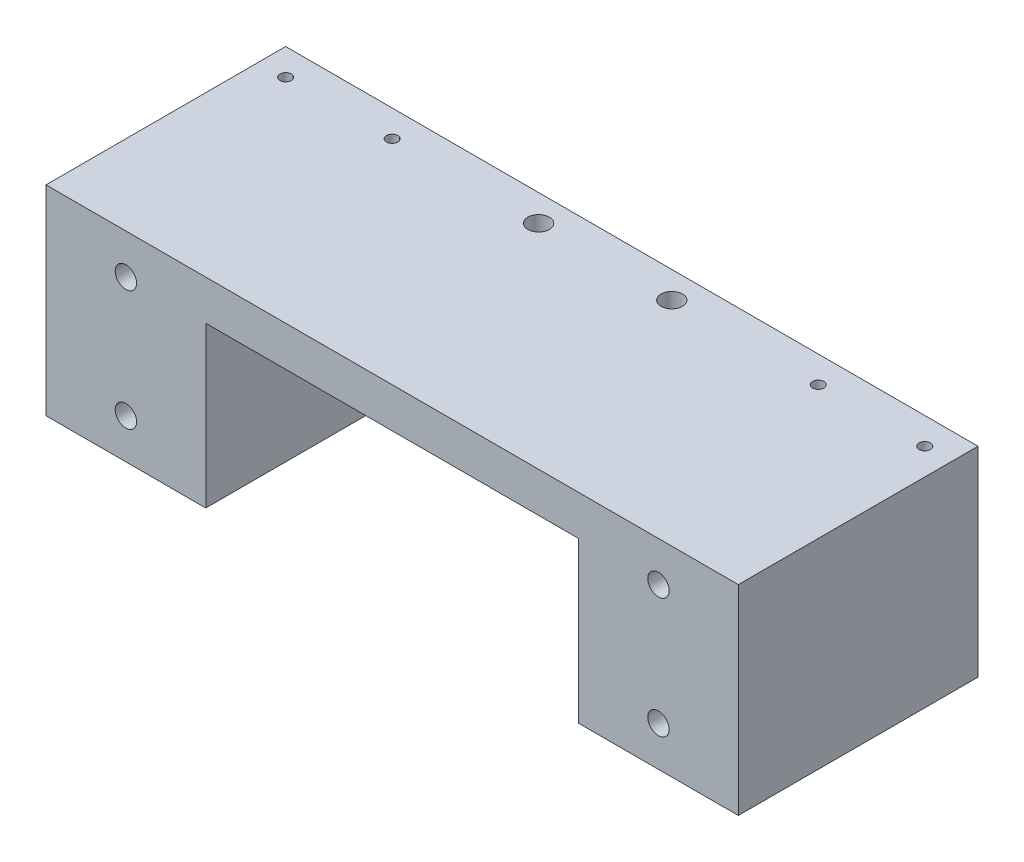
ISO-10303-21;
HEADER;
FILE_DESCRIPTION(('STEP AP214'),'2;1');
FILE_NAME('part.step','',(''),(''),'','','');
FILE_SCHEMA(('AUTOMOTIVE_DESIGN { 1 0 10303 214 1 1 1 1 }'));
ENDSEC;
DATA;
#1=APPLICATION_CONTEXT('core data for automotive mechanical design processes');
#2=APPLICATION_PROTOCOL_DEFINITION('international standard','automotive_design',2000,#1);
#3=PRODUCT_CONTEXT('',#1,'mechanical');
#4=PRODUCT('Part','Part','',(#3));
#5=PRODUCT_RELATED_PRODUCT_CATEGORY('part','',(#4));
#6=PRODUCT_DEFINITION_FORMATION('','',#4);
#7=PRODUCT_DEFINITION_CONTEXT('part definition',#1,'design');
#8=PRODUCT_DEFINITION('design','',#6,#7);
#9=PRODUCT_DEFINITION_SHAPE('','',#8);
#10=(LENGTH_UNIT() NAMED_UNIT(*) SI_UNIT(.MILLI.,.METRE.));
#11=(NAMED_UNIT(*) PLANE_ANGLE_UNIT() SI_UNIT($,.RADIAN.));
#12=(NAMED_UNIT(*) SI_UNIT($,.STERADIAN.) SOLID_ANGLE_UNIT());
#13=UNCERTAINTY_MEASURE_WITH_UNIT(LENGTH_MEASURE(1.E-05),#10,'distance_accuracy_value','');
#14=(GEOMETRIC_REPRESENTATION_CONTEXT(3) GLOBAL_UNCERTAINTY_ASSIGNED_CONTEXT((#13)) GLOBAL_UNIT_ASSIGNED_CONTEXT((#10,
#11,#12)) REPRESENTATION_CONTEXT('',''));
#15=CARTESIAN_POINT('',(0.,0.,0.));
#16=DIRECTION('',(0.,0.,1.));
#17=DIRECTION('',(1.,0.,0.));
#18=AXIS2_PLACEMENT_3D('',#15,#16,#17);
#19=CARTESIAN_POINT('',(3.17499999999999,98.425,-52.3875));
#20=DIRECTION('',(-1.,0.,0.));
#21=DIRECTION('',(0.,0.,1.));
#22=AXIS2_PLACEMENT_3D('',#19,#20,#21);
#23=PLANE('',#22);
#24=DIRECTION('',(0.,-1.,0.));
#25=VECTOR('',#24,1.);
#26=CARTESIAN_POINT('',(3.17499999999999,98.425,-49.2125));
#27=LINE('',#26,#25);
#28=CARTESIAN_POINT('',(3.17499999999999,104.775,-49.2125));
#29=VERTEX_POINT('',#28);
#30=CARTESIAN_POINT('',(3.17499999999999,98.425,-49.2125));
#31=VERTEX_POINT('',#30);
#32=EDGE_CURVE('E113',#29,#31,#27,.T.);
#33=ORIENTED_EDGE('',*,*,#32,.T.);
#34=DIRECTION('',(0.,0.,1.));
#35=VECTOR('',#34,1.);
#36=CARTESIAN_POINT('',(3.17499999999999,98.425,-52.3875));
#37=LINE('',#36,#35);
#38=CARTESIAN_POINT('',(3.17499999999999,98.425,-52.3875));
#39=VERTEX_POINT('',#38);
#40=EDGE_CURVE('E12',#39,#31,#37,.T.);
#41=ORIENTED_EDGE('',*,*,#40,.F.);
#42=DIRECTION('',(0.,-1.,0.));
#43=VECTOR('',#42,1.);
#44=CARTESIAN_POINT('',(3.17499999999999,98.425,-52.3875));
#45=LINE('',#44,#43);
#46=CARTESIAN_POINT('',(3.17499999999999,104.775,-52.3875));
#47=VERTEX_POINT('',#46);
#48=EDGE_CURVE('E101',#47,#39,#45,.T.);
#49=ORIENTED_EDGE('',*,*,#48,.F.);
#50=DIRECTION('',(0.,0.,1.));
#51=VECTOR('',#50,1.);
#52=CARTESIAN_POINT('',(3.17499999999999,104.775,-52.3875));
#53=LINE('',#52,#51);
#54=EDGE_CURVE('E109',#47,#29,#53,.T.);
#55=ORIENTED_EDGE('',*,*,#54,.T.);
#56=EDGE_LOOP('',(#33,#41,#49,#55));
#57=FACE_BOUND('',#56,.T.);
#58=ADVANCED_FACE('F50',(#57),#23,.F.);
#59=CARTESIAN_POINT('',(-3.17500000000001,98.425,-52.3875));
#60=DIRECTION('',(0.,1.,0.));
#61=DIRECTION('',(0.,0.,1.));
#62=AXIS2_PLACEMENT_3D('',#59,#60,#61);
#63=PLANE('',#62);
#64=DIRECTION('',(-1.,0.,0.));
#65=VECTOR('',#64,1.);
#66=CARTESIAN_POINT('',(-3.17500000000001,98.425,-49.2125));
#67=LINE('',#66,#65);
#68=CARTESIAN_POINT('',(-3.17500000000001,98.425,-49.2125));
#69=VERTEX_POINT('',#68);
#70=EDGE_CURVE('E105',#31,#69,#67,.T.);
#71=ORIENTED_EDGE('',*,*,#70,.T.);
#72=DIRECTION('',(0.,0.,1.));
#73=VECTOR('',#72,1.);
#74=CARTESIAN_POINT('',(-3.17500000000001,98.425,-52.3875));
#75=LINE('',#74,#73);
#76=CARTESIAN_POINT('',(-3.17500000000001,98.425,-52.3875));
#77=VERTEX_POINT('',#76);
#78=EDGE_CURVE('E58',#77,#69,#75,.T.);
#79=ORIENTED_EDGE('',*,*,#78,.F.);
#80=DIRECTION('',(-1.,0.,0.));
#81=VECTOR('',#80,1.);
#82=CARTESIAN_POINT('',(-3.17500000000001,98.425,-52.3875));
#83=LINE('',#82,#81);
#84=EDGE_CURVE('E96',#39,#77,#83,.T.);
#85=ORIENTED_EDGE('',*,*,#84,.F.);
#86=ORIENTED_EDGE('',*,*,#40,.T.);
#87=EDGE_LOOP('',(#71,#79,#85,#86));
#88=FACE_BOUND('',#87,.T.);
#89=ADVANCED_FACE('F104',(#88),#63,.F.);
#90=CARTESIAN_POINT('',(-3.17500000000001,98.425,-52.3875));
#91=DIRECTION('',(1.,0.,0.));
#92=DIRECTION('',(0.,0.,-1.));
#93=AXIS2_PLACEMENT_3D('',#90,#91,#92);
#94=PLANE('',#93);
#95=DIRECTION('',(0.,1.,0.));
#96=VECTOR('',#95,1.);
#97=CARTESIAN_POINT('',(-3.17500000000001,98.425,-49.2125));
#98=LINE('',#97,#96);
#99=CARTESIAN_POINT('',(-3.17500000000001,104.775,-49.2125));
#100=VERTEX_POINT('',#99);
#101=EDGE_CURVE('E83',#69,#100,#98,.T.);
#102=ORIENTED_EDGE('',*,*,#101,.T.);
#103=DIRECTION('',(0.,0.,1.));
#104=VECTOR('',#103,1.);
#105=CARTESIAN_POINT('',(-3.17500000000001,104.775,-52.3875));
#106=LINE('',#105,#104);
#107=CARTESIAN_POINT('',(-3.17500000000001,104.775,-52.3875));
#108=VERTEX_POINT('',#107);
#109=EDGE_CURVE('E106',#108,#100,#106,.T.);
#110=ORIENTED_EDGE('',*,*,#109,.F.);
#111=DIRECTION('',(0.,1.,0.));
#112=VECTOR('',#111,1.);
#113=CARTESIAN_POINT('',(-3.17500000000001,98.425,-52.3875));
#114=LINE('',#113,#112);
#115=EDGE_CURVE('E99',#77,#108,#114,.T.);
#116=ORIENTED_EDGE('',*,*,#115,.F.);
#117=ORIENTED_EDGE('',*,*,#78,.T.);
#118=EDGE_LOOP('',(#102,#110,#116,#117));
#119=FACE_BOUND('',#118,.T.);
#120=ADVANCED_FACE('F107',(#119),#94,.F.);
#121=CARTESIAN_POINT('',(-3.17500000000001,104.775,-52.3875));
#122=DIRECTION('',(0.,-1.,0.));
#123=DIRECTION('',(0.,0.,-1.));
#124=AXIS2_PLACEMENT_3D('',#121,#122,#123);
#125=PLANE('',#124);
#126=DIRECTION('',(1.,0.,0.));
#127=VECTOR('',#126,1.);
#128=CARTESIAN_POINT('',(-3.17500000000001,104.775,-49.2125));
#129=LINE('',#128,#127);
#130=EDGE_CURVE('E89',#100,#29,#129,.T.);
#131=ORIENTED_EDGE('',*,*,#130,.T.);
#132=ORIENTED_EDGE('',*,*,#54,.F.);
#133=DIRECTION('',(1.,0.,0.));
#134=VECTOR('',#133,1.);
#135=CARTESIAN_POINT('',(-3.17500000000001,104.775,-52.3875));
#136=LINE('',#135,#134);
#137=EDGE_CURVE('E66',#108,#47,#136,.T.);
#138=ORIENTED_EDGE('',*,*,#137,.F.);
#139=ORIENTED_EDGE('',*,*,#109,.T.);
#140=EDGE_LOOP('',(#131,#132,#138,#139));
#141=FACE_BOUND('',#140,.T.);
#142=ADVANCED_FACE('F121',(#141),#125,.F.);
#143=CARTESIAN_POINT('',(0.,0.,-52.3875));
#144=DIRECTION('',(0.,0.,-1.));
#145=DIRECTION('',(-1.,0.,0.));
#146=AXIS2_PLACEMENT_3D('',#143,#144,#145);
#147=PLANE('',#146);
#148=CARTESIAN_POINT('',(0.,101.6,-52.3875));
#149=DIRECTION('',(0.,0.,-1.));
#150=DIRECTION('',(-1.,0.,0.));
#151=AXIS2_PLACEMENT_3D('',#148,#149,#150);
#152=CIRCLE('',#151,1.5875);
#153=CARTESIAN_POINT('',(-1.5875,101.6,-52.3875));
#154=VERTEX_POINT('',#153);
#155=EDGE_CURVE('E129',#154,#154,#152,.T.);
#156=ORIENTED_EDGE('',*,*,#155,.F.);
#157=EDGE_LOOP('',(#156));
#158=FACE_BOUND('',#157,.T.);
#159=ORIENTED_EDGE('',*,*,#48,.T.);
#160=ORIENTED_EDGE('',*,*,#84,.T.);
#161=ORIENTED_EDGE('',*,*,#115,.T.);
#162=ORIENTED_EDGE('',*,*,#137,.T.);
#163=EDGE_LOOP('',(#159,#160,#161,#162));
#164=FACE_BOUND('',#163,.T.);
#165=ADVANCED_FACE('F97',(#158,#164),#147,.T.);
#166=CARTESIAN_POINT('',(0.,0.,-49.2125));
#167=DIRECTION('',(0.,0.,-1.));
#168=DIRECTION('',(-1.,0.,0.));
#169=AXIS2_PLACEMENT_3D('',#166,#167,#168);
#170=PLANE('',#169);
#171=CARTESIAN_POINT('',(0.,101.6,-49.2125));
#172=DIRECTION('',(0.,0.,-1.));
#173=DIRECTION('',(-1.,0.,0.));
#174=AXIS2_PLACEMENT_3D('',#171,#172,#173);
#175=CIRCLE('',#174,1.5875);
#176=CARTESIAN_POINT('',(-1.5875,101.6,-49.2125));
#177=VERTEX_POINT('',#176);
#178=EDGE_CURVE('E116',#177,#177,#175,.F.);
#179=ORIENTED_EDGE('',*,*,#178,.F.);
#180=EDGE_LOOP('',(#179));
#181=FACE_BOUND('',#180,.T.);
#182=ORIENTED_EDGE('',*,*,#32,.F.);
#183=ORIENTED_EDGE('',*,*,#130,.F.);
#184=ORIENTED_EDGE('',*,*,#101,.F.);
#185=ORIENTED_EDGE('',*,*,#70,.F.);
#186=EDGE_LOOP('',(#182,#183,#184,#185));
#187=FACE_BOUND('',#186,.T.);
#188=ADVANCED_FACE('F124',(#181,#187),#170,.F.);
#189=CARTESIAN_POINT('',(0.,101.6,19.051));
#190=DIRECTION('',(0.,0.,-1.));
#191=DIRECTION('',(-1.,0.,0.));
#192=AXIS2_PLACEMENT_3D('',#189,#190,#191);
#193=CYLINDRICAL_SURFACE('',#192,1.5875);
#194=ORIENTED_EDGE('',*,*,#155,.T.);
#195=EDGE_LOOP('',(#194));
#196=FACE_BOUND('',#195,.T.);
#197=ORIENTED_EDGE('',*,*,#178,.T.);
#198=EDGE_LOOP('',(#197));
#199=FACE_BOUND('',#198,.T.);
#200=ADVANCED_FACE('F133',(#196,#199),#193,.F.);
#201=CLOSED_SHELL('',(#58,#89,#120,#142,#165,#188,#200));
#202=MANIFOLD_SOLID_BREP('B2',#201);
#203=CARTESIAN_POINT('',(82.55,-114.3,19.05));
#204=DIRECTION('',(-1.,0.,0.));
#205=DIRECTION('',(0.,0.,1.));
#206=AXIS2_PLACEMENT_3D('',#203,#204,#205);
#207=PLANE('',#206);
#208=DIRECTION('',(0.,0.,-1.));
#209=VECTOR('',#208,1.);
#210=CARTESIAN_POINT('',(82.55,114.3,19.05));
#211=LINE('',#210,#209);
#212=CARTESIAN_POINT('',(82.5499999999999,114.3,0.));
#213=VERTEX_POINT('',#212);
#214=CARTESIAN_POINT('',(82.55,114.3,-57.15));
#215=VERTEX_POINT('',#214);
#216=EDGE_CURVE('E48',#213,#215,#211,.T.);
#217=ORIENTED_EDGE('',*,*,#216,.F.);
#218=DIRECTION('',(0.,-1.,0.));
#219=VECTOR('',#218,1.);
#220=CARTESIAN_POINT('',(82.55,-114.3,0.));
#221=LINE('',#220,#219);
#222=CARTESIAN_POINT('',(82.55,66.6142131223968,0.));
#223=VERTEX_POINT('',#222);
#224=EDGE_CURVE('E260',#213,#223,#221,.T.);
#225=ORIENTED_EDGE('',*,*,#224,.T.);
#226=DIRECTION('',(0.,0.,-1.));
#227=VECTOR('',#226,1.);
#228=CARTESIAN_POINT('',(82.55,66.6142131223968,-57.15));
#229=LINE('',#228,#227);
#230=CARTESIAN_POINT('',(82.55,66.6142131223968,-57.15));
#231=VERTEX_POINT('',#230);
#232=EDGE_CURVE('E309',#223,#231,#229,.T.);
#233=ORIENTED_EDGE('',*,*,#232,.T.);
#234=DIRECTION('',(0.,-1.,0.));
#235=VECTOR('',#234,1.);
#236=CARTESIAN_POINT('',(82.55,114.3,-57.15));
#237=LINE('',#236,#235);
#238=EDGE_CURVE('E282',#215,#231,#237,.T.);
#239=ORIENTED_EDGE('',*,*,#238,.F.);
#240=EDGE_LOOP('',(#217,#225,#233,#239));
#241=FACE_BOUND('',#240,.T.);
#242=ADVANCED_FACE('F194',(#241),#207,.F.);
#243=CARTESIAN_POINT('',(82.55,104.775,-57.15));
#244=DIRECTION('',(0.,1.,0.));
#245=DIRECTION('',(0.,0.,1.));
#246=AXIS2_PLACEMENT_3D('',#243,#244,#245);
#247=PLANE('',#246);
#248=CARTESIAN_POINT('',(15.875,104.775,-50.8));
#249=DIRECTION('',(0.,1.,0.));
#250=DIRECTION('',(0.,0.,1.));
#251=AXIS2_PLACEMENT_3D('',#248,#249,#250);
#252=CIRCLE('',#251,2.55269999999998);
#253=CARTESIAN_POINT('',(15.875,104.775,-48.2473));
#254=VERTEX_POINT('',#253);
#255=EDGE_CURVE('E294',#254,#254,#252,.T.);
#256=ORIENTED_EDGE('',*,*,#255,.T.);
#257=EDGE_LOOP('',(#256));
#258=FACE_BOUND('',#257,.T.);
#259=CARTESIAN_POINT('',(-15.875,104.775,-50.8));
#260=DIRECTION('',(0.,1.,0.));
#261=DIRECTION('',(0.,0.,1.));
#262=AXIS2_PLACEMENT_3D('',#259,#260,#261);
#263=CIRCLE('',#262,2.55269999999998);
#264=CARTESIAN_POINT('',(-15.875,104.775,-48.2473));
#265=VERTEX_POINT('',#264);
#266=EDGE_CURVE('E283',#265,#265,#263,.T.);
#267=ORIENTED_EDGE('',*,*,#266,.T.);
#268=EDGE_LOOP('',(#267));
#269=FACE_BOUND('',#268,.T.);
#270=DIRECTION('',(-1.,0.,0.));
#271=VECTOR('',#270,1.);
#272=CARTESIAN_POINT('',(82.55,104.775,0.));
#273=LINE('',#272,#271);
#274=CARTESIAN_POINT('',(44.45,104.775,0.));
#275=VERTEX_POINT('',#274);
#276=CARTESIAN_POINT('',(-44.45,104.775,0.));
#277=VERTEX_POINT('',#276);
#278=EDGE_CURVE('E281',#275,#277,#273,.T.);
#279=ORIENTED_EDGE('',*,*,#278,.T.);
#280=DIRECTION('',(0.,0.,-1.));
#281=VECTOR('',#280,1.);
#282=CARTESIAN_POINT('',(-44.45,104.775,-57.15));
#283=LINE('',#282,#281);
#284=CARTESIAN_POINT('',(-44.45,104.775,-57.15));
#285=VERTEX_POINT('',#284);
#286=EDGE_CURVE('E216',#277,#285,#283,.T.);
#287=ORIENTED_EDGE('',*,*,#286,.T.);
#288=DIRECTION('',(-1.,0.,0.));
#289=VECTOR('',#288,1.);
#290=CARTESIAN_POINT('',(82.55,104.775,-57.15));
#291=LINE('',#290,#289);
#292=CARTESIAN_POINT('',(44.45,104.775,-57.15));
#293=VERTEX_POINT('',#292);
#294=EDGE_CURVE('E286',#293,#285,#291,.T.);
#295=ORIENTED_EDGE('',*,*,#294,.F.);
#296=DIRECTION('',(0.,0.,1.));
#297=VECTOR('',#296,1.);
#298=CARTESIAN_POINT('',(44.45,104.775,-57.15));
#299=LINE('',#298,#297);
#300=EDGE_CURVE('E300',#293,#275,#299,.T.);
#301=ORIENTED_EDGE('',*,*,#300,.T.);
#302=EDGE_LOOP('',(#279,#287,#295,#301));
#303=FACE_BOUND('',#302,.T.);
#304=ADVANCED_FACE('F414',(#258,#269,#303),#247,.F.);
#305=CARTESIAN_POINT('',(-82.55,114.3,19.05));
#306=DIRECTION('',(0.,-1.,0.));
#307=DIRECTION('',(0.,0.,-1.));
#308=AXIS2_PLACEMENT_3D('',#305,#306,#307);
#309=PLANE('',#308);
#310=CARTESIAN_POINT('',(-76.2,114.3,-50.8));
#311=DIRECTION('',(0.,1.,0.));
#312=DIRECTION('',(0.,0.,1.));
#313=AXIS2_PLACEMENT_3D('',#310,#311,#312);
#314=CIRCLE('',#313,1.35254999999998);
#315=CARTESIAN_POINT('',(-76.2,114.3,-49.44745));
#316=VERTEX_POINT('',#315);
#317=EDGE_CURVE('E355',#316,#316,#314,.T.);
#318=ORIENTED_EDGE('',*,*,#317,.F.);
#319=EDGE_LOOP('',(#318));
#320=FACE_BOUND('',#319,.T.);
#321=CARTESIAN_POINT('',(-50.8,114.3,-50.8));
#322=DIRECTION('',(0.,1.,0.));
#323=DIRECTION('',(0.,0.,1.));
#324=AXIS2_PLACEMENT_3D('',#321,#322,#323);
#325=CIRCLE('',#324,1.35254999999999);
#326=CARTESIAN_POINT('',(-50.8,114.3,-49.44745));
#327=VERTEX_POINT('',#326);
#328=EDGE_CURVE('E349',#327,#327,#325,.T.);
#329=ORIENTED_EDGE('',*,*,#328,.F.);
#330=EDGE_LOOP('',(#329));
#331=FACE_BOUND('',#330,.T.);
#332=CARTESIAN_POINT('',(50.7999999999999,114.3,-50.8));
#333=DIRECTION('',(0.,1.,0.));
#334=DIRECTION('',(0.,0.,1.));
#335=AXIS2_PLACEMENT_3D('',#332,#333,#334);
#336=CIRCLE('',#335,1.35254999999999);
#337=CARTESIAN_POINT('',(50.7999999999999,114.3,-49.44745));
#338=VERTEX_POINT('',#337);
#339=EDGE_CURVE('E343',#338,#338,#336,.T.);
#340=ORIENTED_EDGE('',*,*,#339,.F.);
#341=EDGE_LOOP('',(#340));
#342=FACE_BOUND('',#341,.T.);
#343=CARTESIAN_POINT('',(76.1999999999999,114.3,-50.8));
#344=DIRECTION('',(0.,1.,0.));
#345=DIRECTION('',(0.,0.,1.));
#346=AXIS2_PLACEMENT_3D('',#343,#344,#345);
#347=CIRCLE('',#346,1.35254999999998);
#348=CARTESIAN_POINT('',(76.1999999999999,114.3,-49.44745));
#349=VERTEX_POINT('',#348);
#350=EDGE_CURVE('E337',#349,#349,#347,.T.);
#351=ORIENTED_EDGE('',*,*,#350,.F.);
#352=EDGE_LOOP('',(#351));
#353=FACE_BOUND('',#352,.T.);
#354=DIRECTION('',(0.,0.,-1.));
#355=VECTOR('',#354,1.);
#356=CARTESIAN_POINT('',(-82.55,114.3,19.05));
#357=LINE('',#356,#355);
#358=CARTESIAN_POINT('',(-82.55,114.3,0.));
#359=VERTEX_POINT('',#358);
#360=CARTESIAN_POINT('',(-82.55,114.3,-57.15));
#361=VERTEX_POINT('',#360);
#362=EDGE_CURVE('E201',#359,#361,#357,.T.);
#363=ORIENTED_EDGE('',*,*,#362,.F.);
#364=DIRECTION('',(1.,0.,0.));
#365=VECTOR('',#364,1.);
#366=CARTESIAN_POINT('',(-104.775,114.3,0.));
#367=LINE('',#366,#365);
#368=EDGE_CURVE('E257',#359,#213,#367,.T.);
#369=ORIENTED_EDGE('',*,*,#368,.T.);
#370=ORIENTED_EDGE('',*,*,#216,.T.);
#371=DIRECTION('',(1.,0.,0.));
#372=VECTOR('',#371,1.);
#373=CARTESIAN_POINT('',(82.55,114.3,-57.15));
#374=LINE('',#373,#372);
#375=EDGE_CURVE('E277',#361,#215,#374,.T.);
#376=ORIENTED_EDGE('',*,*,#375,.F.);
#377=EDGE_LOOP('',(#363,#369,#370,#376));
#378=FACE_BOUND('',#377,.T.);
#379=CARTESIAN_POINT('',(-15.875,114.3,-50.8));
#380=DIRECTION('',(0.,1.,0.));
#381=DIRECTION('',(0.,0.,1.));
#382=AXIS2_PLACEMENT_3D('',#379,#380,#381);
#383=CIRCLE('',#382,2.55269999999999);
#384=CARTESIAN_POINT('',(-15.875,114.3,-48.2473));
#385=VERTEX_POINT('',#384);
#386=EDGE_CURVE('E291',#385,#385,#383,.T.);
#387=ORIENTED_EDGE('',*,*,#386,.F.);
#388=EDGE_LOOP('',(#387));
#389=FACE_BOUND('',#388,.T.);
#390=CARTESIAN_POINT('',(15.875,114.3,-50.8));
#391=DIRECTION('',(0.,1.,0.));
#392=DIRECTION('',(0.,0.,1.));
#393=AXIS2_PLACEMENT_3D('',#390,#391,#392);
#394=CIRCLE('',#393,2.55269999999999);
#395=CARTESIAN_POINT('',(15.875,114.3,-48.2473));
#396=VERTEX_POINT('',#395);
#397=EDGE_CURVE('E297',#396,#396,#394,.T.);
#398=ORIENTED_EDGE('',*,*,#397,.F.);
#399=EDGE_LOOP('',(#398));
#400=FACE_BOUND('',#399,.T.);
#401=ADVANCED_FACE('F274',(#320,#331,#342,#353,#378,#389,#400),#309,.F.);
#402=CARTESIAN_POINT('',(-82.55,-114.3,19.05));
#403=DIRECTION('',(1.,0.,0.));
#404=DIRECTION('',(0.,0.,-1.));
#405=AXIS2_PLACEMENT_3D('',#402,#403,#404);
#406=PLANE('',#405);
#407=DIRECTION('',(0.,0.,-1.));
#408=VECTOR('',#407,1.);
#409=CARTESIAN_POINT('',(-82.55,66.6142131223968,-57.15));
#410=LINE('',#409,#408);
#411=CARTESIAN_POINT('',(-82.55,66.6142131223968,0.));
#412=VERTEX_POINT('',#411);
#413=CARTESIAN_POINT('',(-82.55,66.6142131223968,-57.15));
#414=VERTEX_POINT('',#413);
#415=EDGE_CURVE('E271',#412,#414,#410,.T.);
#416=ORIENTED_EDGE('',*,*,#415,.F.);
#417=DIRECTION('',(0.,1.,0.));
#418=VECTOR('',#417,1.);
#419=CARTESIAN_POINT('',(-82.55,-114.3,0.));
#420=LINE('',#419,#418);
#421=EDGE_CURVE('E208',#412,#359,#420,.T.);
#422=ORIENTED_EDGE('',*,*,#421,.T.);
#423=ORIENTED_EDGE('',*,*,#362,.T.);
#424=DIRECTION('',(0.,1.,0.));
#425=VECTOR('',#424,1.);
#426=CARTESIAN_POINT('',(-82.55,114.3,-57.15));
#427=LINE('',#426,#425);
#428=EDGE_CURVE('E278',#414,#361,#427,.T.);
#429=ORIENTED_EDGE('',*,*,#428,.F.);
#430=EDGE_LOOP('',(#416,#422,#423,#429));
#431=FACE_BOUND('',#430,.T.);
#432=ADVANCED_FACE('F268',(#431),#406,.F.);
#433=CARTESIAN_POINT('',(0.,0.,-57.15));
#434=DIRECTION('',(0.,0.,-1.));
#435=DIRECTION('',(-1.,0.,0.));
#436=AXIS2_PLACEMENT_3D('',#433,#434,#435);
#437=PLANE('',#436);
#438=CARTESIAN_POINT('',(-63.5,104.775,-57.15));
#439=DIRECTION('',(0.,0.,1.));
#440=DIRECTION('',(1.,0.,0.));
#441=AXIS2_PLACEMENT_3D('',#438,#439,#440);
#442=CIRCLE('',#441,2.55269999999999);
#443=CARTESIAN_POINT('',(-60.9473,104.775,-57.15));
#444=VERTEX_POINT('',#443);
#445=EDGE_CURVE('E376',#444,#444,#442,.T.);
#446=ORIENTED_EDGE('',*,*,#445,.T.);
#447=EDGE_LOOP('',(#446));
#448=FACE_BOUND('',#447,.T.);
#449=CARTESIAN_POINT('',(-63.5,76.1392131223969,-57.15));
#450=DIRECTION('',(0.,0.,1.));
#451=DIRECTION('',(1.,0.,0.));
#452=AXIS2_PLACEMENT_3D('',#449,#450,#451);
#453=CIRCLE('',#452,2.55269999999999);
#454=CARTESIAN_POINT('',(-60.9473,76.1392131223969,-57.15));
#455=VERTEX_POINT('',#454);
#456=EDGE_CURVE('E370',#455,#455,#453,.T.);
#457=ORIENTED_EDGE('',*,*,#456,.T.);
#458=EDGE_LOOP('',(#457));
#459=FACE_BOUND('',#458,.T.);
#460=CARTESIAN_POINT('',(63.5,104.775,-57.15));
#461=DIRECTION('',(0.,0.,1.));
#462=DIRECTION('',(1.,0.,0.));
#463=AXIS2_PLACEMENT_3D('',#460,#461,#462);
#464=CIRCLE('',#463,2.55269999999999);
#465=CARTESIAN_POINT('',(66.0527,104.775,-57.15));
#466=VERTEX_POINT('',#465);
#467=EDGE_CURVE('E364',#466,#466,#464,.T.);
#468=ORIENTED_EDGE('',*,*,#467,.T.);
#469=EDGE_LOOP('',(#468));
#470=FACE_BOUND('',#469,.T.);
#471=CARTESIAN_POINT('',(63.5,76.1392131223969,-57.15));
#472=DIRECTION('',(0.,0.,1.));
#473=DIRECTION('',(1.,0.,0.));
#474=AXIS2_PLACEMENT_3D('',#471,#472,#473);
#475=CIRCLE('',#474,2.55269999999999);
#476=CARTESIAN_POINT('',(66.0527,76.1392131223969,-57.15));
#477=VERTEX_POINT('',#476);
#478=EDGE_CURVE('E358',#477,#477,#475,.T.);
#479=ORIENTED_EDGE('',*,*,#478,.T.);
#480=EDGE_LOOP('',(#479));
#481=FACE_BOUND('',#480,.T.);
#482=ORIENTED_EDGE('',*,*,#294,.T.);
#483=DIRECTION('',(0.,1.,0.));
#484=VECTOR('',#483,1.);
#485=CARTESIAN_POINT('',(-44.45,114.3,-57.15));
#486=LINE('',#485,#484);
#487=CARTESIAN_POINT('',(-44.45,66.6142131223968,-57.15));
#488=VERTEX_POINT('',#487);
#489=EDGE_CURVE('E327',#488,#285,#486,.T.);
#490=ORIENTED_EDGE('',*,*,#489,.F.);
#491=DIRECTION('',(-1.,0.,0.));
#492=VECTOR('',#491,1.);
#493=CARTESIAN_POINT('',(-44.45,66.6142131223968,-57.15));
#494=LINE('',#493,#492);
#495=EDGE_CURVE('E321',#488,#414,#494,.T.);
#496=ORIENTED_EDGE('',*,*,#495,.T.);
#497=ORIENTED_EDGE('',*,*,#428,.T.);
#498=ORIENTED_EDGE('',*,*,#375,.T.);
#499=ORIENTED_EDGE('',*,*,#238,.T.);
#500=DIRECTION('',(1.,0.,0.));
#501=VECTOR('',#500,1.);
#502=CARTESIAN_POINT('',(44.45,66.6142131223968,-57.15));
#503=LINE('',#502,#501);
#504=CARTESIAN_POINT('',(44.45,66.6142131223968,-57.15));
#505=VERTEX_POINT('',#504);
#506=EDGE_CURVE('E303',#505,#231,#503,.T.);
#507=ORIENTED_EDGE('',*,*,#506,.F.);
#508=DIRECTION('',(0.,1.,0.));
#509=VECTOR('',#508,1.);
#510=CARTESIAN_POINT('',(44.45,114.3,-57.15));
#511=LINE('',#510,#509);
#512=EDGE_CURVE('E312',#505,#293,#511,.T.);
#513=ORIENTED_EDGE('',*,*,#512,.T.);
#514=EDGE_LOOP('',(#482,#490,#496,#497,#498,#499,#507,#513));
#515=FACE_BOUND('',#514,.T.);
#516=ADVANCED_FACE('F424',(#448,#459,#470,#481,#515),#437,.T.);
#517=CARTESIAN_POINT('',(-15.875,114.3,-50.8));
#518=DIRECTION('',(0.,1.,0.));
#519=DIRECTION('',(0.,0.,1.));
#520=AXIS2_PLACEMENT_3D('',#517,#518,#519);
#521=CYLINDRICAL_SURFACE('',#520,2.55269999999998);
#522=ORIENTED_EDGE('',*,*,#386,.T.);
#523=EDGE_LOOP('',(#522));
#524=FACE_BOUND('',#523,.T.);
#525=ORIENTED_EDGE('',*,*,#266,.F.);
#526=EDGE_LOOP('',(#525));
#527=FACE_BOUND('',#526,.T.);
#528=ADVANCED_FACE('F454',(#524,#527),#521,.F.);
#529=CARTESIAN_POINT('',(15.875,114.3,-50.8));
#530=DIRECTION('',(0.,1.,0.));
#531=DIRECTION('',(0.,0.,1.));
#532=AXIS2_PLACEMENT_3D('',#529,#530,#531);
#533=CYLINDRICAL_SURFACE('',#532,2.55269999999998);
#534=ORIENTED_EDGE('',*,*,#397,.T.);
#535=EDGE_LOOP('',(#534));
#536=FACE_BOUND('',#535,.T.);
#537=ORIENTED_EDGE('',*,*,#255,.F.);
#538=EDGE_LOOP('',(#537));
#539=FACE_BOUND('',#538,.T.);
#540=ADVANCED_FACE('F447',(#536,#539),#533,.F.);
#541=CARTESIAN_POINT('',(44.45,0.,0.));
#542=DIRECTION('',(-1.,0.,0.));
#543=DIRECTION('',(0.,0.,1.));
#544=AXIS2_PLACEMENT_3D('',#541,#542,#543);
#545=PLANE('',#544);
#546=ORIENTED_EDGE('',*,*,#300,.F.);
#547=ORIENTED_EDGE('',*,*,#512,.F.);
#548=DIRECTION('',(0.,0.,-1.));
#549=VECTOR('',#548,1.);
#550=CARTESIAN_POINT('',(44.45,66.6142131223968,-57.15));
#551=LINE('',#550,#549);
#552=CARTESIAN_POINT('',(44.45,66.6142131223968,0.));
#553=VERTEX_POINT('',#552);
#554=EDGE_CURVE('E306',#553,#505,#551,.T.);
#555=ORIENTED_EDGE('',*,*,#554,.F.);
#556=DIRECTION('',(0.,-1.,0.));
#557=VECTOR('',#556,1.);
#558=CARTESIAN_POINT('',(44.45,114.3,0.));
#559=LINE('',#558,#557);
#560=EDGE_CURVE('E315',#275,#553,#559,.T.);
#561=ORIENTED_EDGE('',*,*,#560,.F.);
#562=EDGE_LOOP('',(#546,#547,#555,#561));
#563=FACE_BOUND('',#562,.T.);
#564=ADVANCED_FACE('F434',(#563),#545,.T.);
#565=CARTESIAN_POINT('',(44.45,66.6142131223968,-57.15));
#566=DIRECTION('',(0.,-1.,0.));
#567=DIRECTION('',(0.,0.,-1.));
#568=AXIS2_PLACEMENT_3D('',#565,#566,#567);
#569=PLANE('',#568);
#570=CARTESIAN_POINT('',(50.7999999999999,66.6142131223968,-50.8));
#571=DIRECTION('',(0.,1.,0.));
#572=DIRECTION('',(0.,0.,1.));
#573=AXIS2_PLACEMENT_3D('',#570,#571,#572);
#574=CIRCLE('',#573,1.35254999999999);
#575=CARTESIAN_POINT('',(50.7999999999999,66.6142131223968,-49.44745));
#576=VERTEX_POINT('',#575);
#577=EDGE_CURVE('E340',#576,#576,#574,.T.);
#578=ORIENTED_EDGE('',*,*,#577,.T.);
#579=EDGE_LOOP('',(#578));
#580=FACE_BOUND('',#579,.T.);
#581=CARTESIAN_POINT('',(76.1999999999999,66.6142131223968,-50.8));
#582=DIRECTION('',(0.,1.,0.));
#583=DIRECTION('',(0.,0.,1.));
#584=AXIS2_PLACEMENT_3D('',#581,#582,#583);
#585=CIRCLE('',#584,1.35254999999999);
#586=CARTESIAN_POINT('',(76.1999999999999,66.6142131223968,-49.44745));
#587=VERTEX_POINT('',#586);
#588=EDGE_CURVE('E264',#587,#587,#585,.T.);
#589=ORIENTED_EDGE('',*,*,#588,.T.);
#590=EDGE_LOOP('',(#589));
#591=FACE_BOUND('',#590,.T.);
#592=ORIENTED_EDGE('',*,*,#232,.F.);
#593=DIRECTION('',(1.,0.,0.));
#594=VECTOR('',#593,1.);
#595=CARTESIAN_POINT('',(44.45,66.6142131223968,0.));
#596=LINE('',#595,#594);
#597=EDGE_CURVE('E304',#553,#223,#596,.T.);
#598=ORIENTED_EDGE('',*,*,#597,.F.);
#599=ORIENTED_EDGE('',*,*,#554,.T.);
#600=ORIENTED_EDGE('',*,*,#506,.T.);
#601=EDGE_LOOP('',(#592,#598,#599,#600));
#602=FACE_BOUND('',#601,.T.);
#603=ADVANCED_FACE('F438',(#580,#591,#602),#569,.T.);
#604=CARTESIAN_POINT('',(-44.45,0.,0.));
#605=DIRECTION('',(1.,0.,0.));
#606=DIRECTION('',(0.,0.,1.));
#607=AXIS2_PLACEMENT_3D('',#604,#605,#606);
#608=PLANE('',#607);
#609=ORIENTED_EDGE('',*,*,#286,.F.);
#610=DIRECTION('',(0.,-1.,0.));
#611=VECTOR('',#610,1.);
#612=CARTESIAN_POINT('',(-44.45,114.3,0.));
#613=LINE('',#612,#611);
#614=CARTESIAN_POINT('',(-44.45,66.6142131223968,0.));
#615=VERTEX_POINT('',#614);
#616=EDGE_CURVE('E324',#277,#615,#613,.T.);
#617=ORIENTED_EDGE('',*,*,#616,.T.);
#618=DIRECTION('',(0.,0.,-1.));
#619=VECTOR('',#618,1.);
#620=CARTESIAN_POINT('',(-44.45,66.6142131223968,-57.15));
#621=LINE('',#620,#619);
#622=EDGE_CURVE('E330',#615,#488,#621,.T.);
#623=ORIENTED_EDGE('',*,*,#622,.T.);
#624=ORIENTED_EDGE('',*,*,#489,.T.);
#625=EDGE_LOOP('',(#609,#617,#623,#624));
#626=FACE_BOUND('',#625,.T.);
#627=ADVANCED_FACE('F430',(#626),#608,.T.);
#628=CARTESIAN_POINT('',(-44.45,66.6142131223968,-57.15));
#629=DIRECTION('',(0.,1.,0.));
#630=DIRECTION('',(0.,0.,1.));
#631=AXIS2_PLACEMENT_3D('',#628,#629,#630);
#632=PLANE('',#631);
#633=CARTESIAN_POINT('',(-76.2,66.6142131223968,-50.8));
#634=DIRECTION('',(0.,1.,0.));
#635=DIRECTION('',(0.,0.,1.));
#636=AXIS2_PLACEMENT_3D('',#633,#634,#635);
#637=CIRCLE('',#636,1.35254999999999);
#638=CARTESIAN_POINT('',(-76.2,66.6142131223968,-49.44745));
#639=VERTEX_POINT('',#638);
#640=EDGE_CURVE('E352',#639,#639,#637,.T.);
#641=ORIENTED_EDGE('',*,*,#640,.T.);
#642=EDGE_LOOP('',(#641));
#643=FACE_BOUND('',#642,.T.);
#644=CARTESIAN_POINT('',(-50.8,66.6142131223968,-50.8));
#645=DIRECTION('',(0.,1.,0.));
#646=DIRECTION('',(0.,0.,1.));
#647=AXIS2_PLACEMENT_3D('',#644,#645,#646);
#648=CIRCLE('',#647,1.35254999999999);
#649=CARTESIAN_POINT('',(-50.8,66.6142131223968,-49.44745));
#650=VERTEX_POINT('',#649);
#651=EDGE_CURVE('E346',#650,#650,#648,.T.);
#652=ORIENTED_EDGE('',*,*,#651,.T.);
#653=EDGE_LOOP('',(#652));
#654=FACE_BOUND('',#653,.T.);
#655=ORIENTED_EDGE('',*,*,#415,.T.);
#656=ORIENTED_EDGE('',*,*,#495,.F.);
#657=ORIENTED_EDGE('',*,*,#622,.F.);
#658=DIRECTION('',(-1.,0.,0.));
#659=VECTOR('',#658,1.);
#660=CARTESIAN_POINT('',(-44.45,66.6142131223968,0.));
#661=LINE('',#660,#659);
#662=EDGE_CURVE('E320',#615,#412,#661,.T.);
#663=ORIENTED_EDGE('',*,*,#662,.T.);
#664=EDGE_LOOP('',(#655,#656,#657,#663));
#665=FACE_BOUND('',#664,.T.);
#666=ADVANCED_FACE('F388',(#643,#654,#665),#632,.F.);
#667=CARTESIAN_POINT('',(-104.775,-114.3,0.));
#668=DIRECTION('',(0.,0.,-1.));
#669=DIRECTION('',(-1.,0.,0.));
#670=AXIS2_PLACEMENT_3D('',#667,#668,#669);
#671=PLANE('',#670);
#672=CARTESIAN_POINT('',(-63.5,104.775,0.));
#673=DIRECTION('',(0.,0.,1.));
#674=DIRECTION('',(1.,0.,0.));
#675=AXIS2_PLACEMENT_3D('',#672,#673,#674);
#676=CIRCLE('',#675,2.5527);
#677=CARTESIAN_POINT('',(-60.9473,104.775,0.));
#678=VERTEX_POINT('',#677);
#679=EDGE_CURVE('E379',#678,#678,#676,.T.);
#680=ORIENTED_EDGE('',*,*,#679,.F.);
#681=EDGE_LOOP('',(#680));
#682=FACE_BOUND('',#681,.T.);
#683=CARTESIAN_POINT('',(-63.5,76.1392131223969,0.));
#684=DIRECTION('',(0.,0.,1.));
#685=DIRECTION('',(1.,0.,0.));
#686=AXIS2_PLACEMENT_3D('',#683,#684,#685);
#687=CIRCLE('',#686,2.5527);
#688=CARTESIAN_POINT('',(-60.9473,76.1392131223969,0.));
#689=VERTEX_POINT('',#688);
#690=EDGE_CURVE('E373',#689,#689,#687,.T.);
#691=ORIENTED_EDGE('',*,*,#690,.F.);
#692=EDGE_LOOP('',(#691));
#693=FACE_BOUND('',#692,.T.);
#694=CARTESIAN_POINT('',(63.5,104.775,0.));
#695=DIRECTION('',(0.,0.,1.));
#696=DIRECTION('',(1.,0.,0.));
#697=AXIS2_PLACEMENT_3D('',#694,#695,#696);
#698=CIRCLE('',#697,2.55270000000001);
#699=CARTESIAN_POINT('',(66.0527,104.775,0.));
#700=VERTEX_POINT('',#699);
#701=EDGE_CURVE('E367',#700,#700,#698,.T.);
#702=ORIENTED_EDGE('',*,*,#701,.F.);
#703=EDGE_LOOP('',(#702));
#704=FACE_BOUND('',#703,.T.);
#705=CARTESIAN_POINT('',(63.5,76.1392131223969,0.));
#706=DIRECTION('',(0.,0.,1.));
#707=DIRECTION('',(1.,0.,0.));
#708=AXIS2_PLACEMENT_3D('',#705,#706,#707);
#709=CIRCLE('',#708,2.55270000000001);
#710=CARTESIAN_POINT('',(66.0527,76.1392131223969,0.));
#711=VERTEX_POINT('',#710);
#712=EDGE_CURVE('E361',#711,#711,#709,.T.);
#713=ORIENTED_EDGE('',*,*,#712,.F.);
#714=EDGE_LOOP('',(#713));
#715=FACE_BOUND('',#714,.T.);
#716=ORIENTED_EDGE('',*,*,#368,.F.);
#717=ORIENTED_EDGE('',*,*,#421,.F.);
#718=ORIENTED_EDGE('',*,*,#662,.F.);
#719=ORIENTED_EDGE('',*,*,#616,.F.);
#720=ORIENTED_EDGE('',*,*,#278,.F.);
#721=ORIENTED_EDGE('',*,*,#560,.T.);
#722=ORIENTED_EDGE('',*,*,#597,.T.);
#723=ORIENTED_EDGE('',*,*,#224,.F.);
#724=EDGE_LOOP('',(#716,#717,#718,#719,#720,#721,#722,#723));
#725=FACE_BOUND('',#724,.T.);
#726=ADVANCED_FACE('F258',(#682,#693,#704,#715,#725),#671,.F.);
#727=CARTESIAN_POINT('',(76.1999999999999,114.3,-50.8));
#728=DIRECTION('',(0.,1.,0.));
#729=DIRECTION('',(0.,0.,1.));
#730=AXIS2_PLACEMENT_3D('',#727,#728,#729);
#731=CYLINDRICAL_SURFACE('',#730,1.35254999999999);
#732=ORIENTED_EDGE('',*,*,#588,.F.);
#733=EDGE_LOOP('',(#732));
#734=FACE_BOUND('',#733,.T.);
#735=ORIENTED_EDGE('',*,*,#350,.T.);
#736=EDGE_LOOP('',(#735));
#737=FACE_BOUND('',#736,.T.);
#738=ADVANCED_FACE('F387',(#734,#737),#731,.F.);
#739=CARTESIAN_POINT('',(50.7999999999999,114.3,-50.8));
#740=DIRECTION('',(0.,1.,0.));
#741=DIRECTION('',(0.,0.,1.));
#742=AXIS2_PLACEMENT_3D('',#739,#740,#741);
#743=CYLINDRICAL_SURFACE('',#742,1.35254999999999);
#744=ORIENTED_EDGE('',*,*,#577,.F.);
#745=EDGE_LOOP('',(#744));
#746=FACE_BOUND('',#745,.T.);
#747=ORIENTED_EDGE('',*,*,#339,.T.);
#748=EDGE_LOOP('',(#747));
#749=FACE_BOUND('',#748,.T.);
#750=ADVANCED_FACE('F476',(#746,#749),#743,.F.);
#751=CARTESIAN_POINT('',(-50.8,114.3,-50.8));
#752=DIRECTION('',(0.,1.,0.));
#753=DIRECTION('',(0.,0.,1.));
#754=AXIS2_PLACEMENT_3D('',#751,#752,#753);
#755=CYLINDRICAL_SURFACE('',#754,1.35254999999999);
#756=ORIENTED_EDGE('',*,*,#651,.F.);
#757=EDGE_LOOP('',(#756));
#758=FACE_BOUND('',#757,.T.);
#759=ORIENTED_EDGE('',*,*,#328,.T.);
#760=EDGE_LOOP('',(#759));
#761=FACE_BOUND('',#760,.T.);
#762=ADVANCED_FACE('F409',(#758,#761),#755,.F.);
#763=CARTESIAN_POINT('',(-76.2,114.3,-50.8));
#764=DIRECTION('',(0.,1.,0.));
#765=DIRECTION('',(0.,0.,1.));
#766=AXIS2_PLACEMENT_3D('',#763,#764,#765);
#767=CYLINDRICAL_SURFACE('',#766,1.35254999999999);
#768=ORIENTED_EDGE('',*,*,#640,.F.);
#769=EDGE_LOOP('',(#768));
#770=FACE_BOUND('',#769,.T.);
#771=ORIENTED_EDGE('',*,*,#317,.T.);
#772=EDGE_LOOP('',(#771));
#773=FACE_BOUND('',#772,.T.);
#774=ADVANCED_FACE('F399',(#770,#773),#767,.F.);
#775=CARTESIAN_POINT('',(63.5,76.1392131223969,0.));
#776=DIRECTION('',(0.,0.,1.));
#777=DIRECTION('',(1.,0.,0.));
#778=AXIS2_PLACEMENT_3D('',#775,#776,#777);
#779=CYLINDRICAL_SURFACE('',#778,2.5527);
#780=ORIENTED_EDGE('',*,*,#478,.F.);
#781=EDGE_LOOP('',(#780));
#782=FACE_BOUND('',#781,.T.);
#783=ORIENTED_EDGE('',*,*,#712,.T.);
#784=EDGE_LOOP('',(#783));
#785=FACE_BOUND('',#784,.T.);
#786=ADVANCED_FACE('F396',(#782,#785),#779,.F.);
#787=CARTESIAN_POINT('',(63.5,104.775,0.));
#788=DIRECTION('',(0.,0.,1.));
#789=DIRECTION('',(1.,0.,0.));
#790=AXIS2_PLACEMENT_3D('',#787,#788,#789);
#791=CYLINDRICAL_SURFACE('',#790,2.5527);
#792=ORIENTED_EDGE('',*,*,#467,.F.);
#793=EDGE_LOOP('',(#792));
#794=FACE_BOUND('',#793,.T.);
#795=ORIENTED_EDGE('',*,*,#701,.T.);
#796=EDGE_LOOP('',(#795));
#797=FACE_BOUND('',#796,.T.);
#798=ADVANCED_FACE('F398',(#794,#797),#791,.F.);
#799=CARTESIAN_POINT('',(-63.5,76.1392131223969,0.));
#800=DIRECTION('',(0.,0.,1.));
#801=DIRECTION('',(1.,0.,0.));
#802=AXIS2_PLACEMENT_3D('',#799,#800,#801);
#803=CYLINDRICAL_SURFACE('',#802,2.55269999999999);
#804=ORIENTED_EDGE('',*,*,#456,.F.);
#805=EDGE_LOOP('',(#804));
#806=FACE_BOUND('',#805,.T.);
#807=ORIENTED_EDGE('',*,*,#690,.T.);
#808=EDGE_LOOP('',(#807));
#809=FACE_BOUND('',#808,.T.);
#810=ADVANCED_FACE('F406',(#806,#809),#803,.F.);
#811=CARTESIAN_POINT('',(-63.5,104.775,0.));
#812=DIRECTION('',(0.,0.,1.));
#813=DIRECTION('',(1.,0.,0.));
#814=AXIS2_PLACEMENT_3D('',#811,#812,#813);
#815=CYLINDRICAL_SURFACE('',#814,2.55269999999999);
#816=ORIENTED_EDGE('',*,*,#445,.F.);
#817=EDGE_LOOP('',(#816));
#818=FACE_BOUND('',#817,.T.);
#819=ORIENTED_EDGE('',*,*,#679,.T.);
#820=EDGE_LOOP('',(#819));
#821=FACE_BOUND('',#820,.T.);
#822=ADVANCED_FACE('F383',(#818,#821),#815,.F.);
#823=CLOSED_SHELL('',(#242,#304,#401,#432,#516,#528,#540,#564,#603,#627,#666,#726,#738,#750,
#762,#774,#786,#798,#810,#822));
#824=MANIFOLD_SOLID_BREP('B6',#823);
#825=ADVANCED_BREP_SHAPE_REPRESENTATION('',(#18,#202,#824),#14);
#826=SHAPE_DEFINITION_REPRESENTATION(#9,#825);
ENDSEC;
END-ISO-10303-21;
